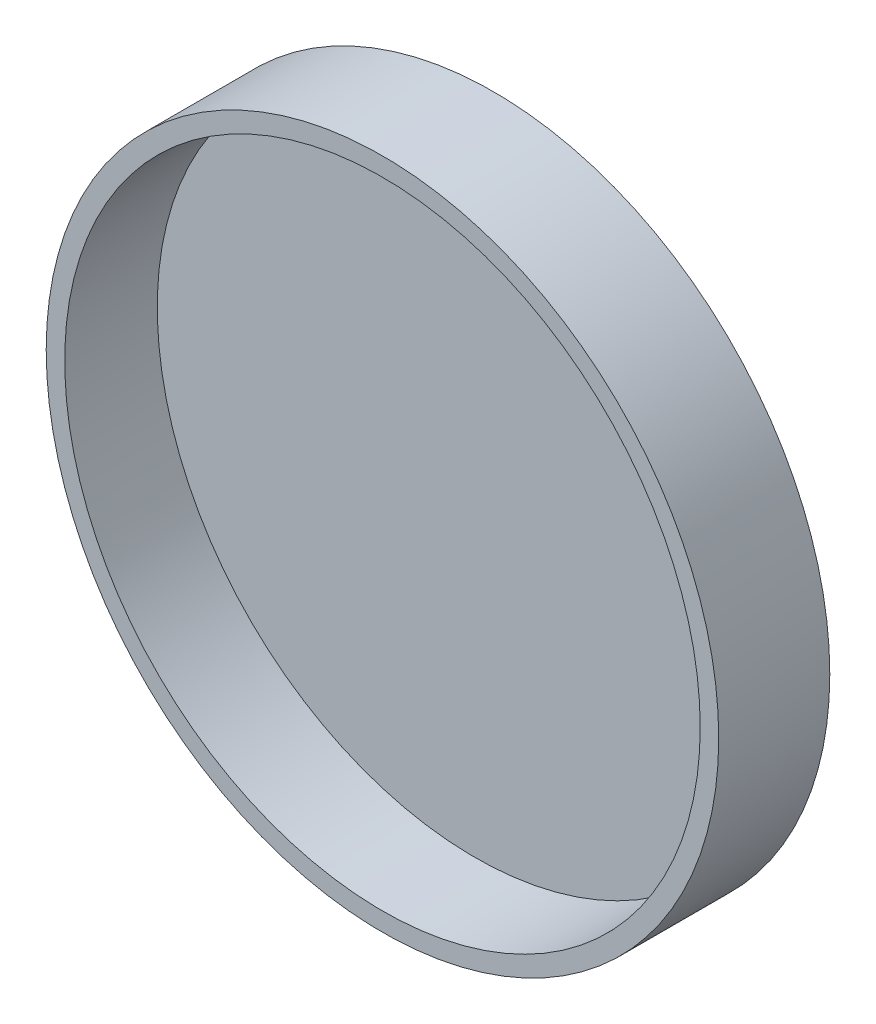
ISO-10303-21;
HEADER;
FILE_DESCRIPTION(('STEP AP214'),'2;1');
FILE_NAME('part.step','',(''),(''),'','','');
FILE_SCHEMA(('AUTOMOTIVE_DESIGN { 1 0 10303 214 1 1 1 1 }'));
ENDSEC;
DATA;
#1=APPLICATION_CONTEXT('core data for automotive mechanical design processes');
#2=APPLICATION_PROTOCOL_DEFINITION('international standard','automotive_design',2000,#1);
#3=PRODUCT_CONTEXT('',#1,'mechanical');
#4=PRODUCT('Part','Part','',(#3));
#5=PRODUCT_RELATED_PRODUCT_CATEGORY('part','',(#4));
#6=PRODUCT_DEFINITION_FORMATION('','',#4);
#7=PRODUCT_DEFINITION_CONTEXT('part definition',#1,'design');
#8=PRODUCT_DEFINITION('design','',#6,#7);
#9=PRODUCT_DEFINITION_SHAPE('','',#8);
#10=(LENGTH_UNIT() NAMED_UNIT(*) SI_UNIT(.MILLI.,.METRE.));
#11=(NAMED_UNIT(*) PLANE_ANGLE_UNIT() SI_UNIT($,.RADIAN.));
#12=(NAMED_UNIT(*) SI_UNIT($,.STERADIAN.) SOLID_ANGLE_UNIT());
#13=UNCERTAINTY_MEASURE_WITH_UNIT(LENGTH_MEASURE(1.E-05),#10,'distance_accuracy_value','');
#14=(GEOMETRIC_REPRESENTATION_CONTEXT(3) GLOBAL_UNCERTAINTY_ASSIGNED_CONTEXT((#13)) GLOBAL_UNIT_ASSIGNED_CONTEXT((#10,
#11,#12)) REPRESENTATION_CONTEXT('',''));
#15=CARTESIAN_POINT('',(0.,0.,0.));
#16=DIRECTION('',(0.,0.,1.));
#17=DIRECTION('',(1.,0.,0.));
#18=AXIS2_PLACEMENT_3D('',#15,#16,#17);
#19=CARTESIAN_POINT('',(0.,0.,15.));
#20=DIRECTION('',(0.,0.,1.));
#21=DIRECTION('',(1.,0.,0.));
#22=AXIS2_PLACEMENT_3D('',#19,#20,#21);
#23=PLANE('',#22);
#24=CARTESIAN_POINT('',(0.,0.,15.));
#25=DIRECTION('',(0.,0.,1.));
#26=DIRECTION('',(1.,0.,0.));
#27=AXIS2_PLACEMENT_3D('',#24,#25,#26);
#28=CIRCLE('',#27,54.5);
#29=CARTESIAN_POINT('',(54.5,0.,15.));
#30=VERTEX_POINT('',#29);
#31=EDGE_CURVE('E10',#30,#30,#28,.T.);
#32=ORIENTED_EDGE('',*,*,#31,.T.);
#33=EDGE_LOOP('',(#32));
#34=FACE_BOUND('',#33,.T.);
#35=CARTESIAN_POINT('',(0.,0.,15.));
#36=DIRECTION('',(0.,0.,1.));
#37=DIRECTION('',(1.,0.,0.));
#38=AXIS2_PLACEMENT_3D('',#35,#36,#37);
#39=CIRCLE('',#38,51.5);
#40=CARTESIAN_POINT('',(51.5,0.,15.));
#41=VERTEX_POINT('',#40);
#42=EDGE_CURVE('E38',#41,#41,#39,.T.);
#43=ORIENTED_EDGE('',*,*,#42,.F.);
#44=EDGE_LOOP('',(#43));
#45=FACE_BOUND('',#44,.T.);
#46=ADVANCED_FACE('F31',(#34,#45),#23,.T.);
#47=CARTESIAN_POINT('',(0.,0.,15.));
#48=DIRECTION('',(0.,0.,-1.));
#49=DIRECTION('',(-1.,0.,0.));
#50=AXIS2_PLACEMENT_3D('',#47,#48,#49);
#51=CYLINDRICAL_SURFACE('',#50,54.5);
#52=ORIENTED_EDGE('',*,*,#31,.F.);
#53=EDGE_LOOP('',(#52));
#54=FACE_BOUND('',#53,.T.);
#55=CARTESIAN_POINT('',(0.,0.,-3.));
#56=DIRECTION('',(0.,0.,-1.));
#57=DIRECTION('',(-1.,0.,0.));
#58=AXIS2_PLACEMENT_3D('',#55,#56,#57);
#59=CIRCLE('',#58,54.5);
#60=CARTESIAN_POINT('',(-54.5,0.,-3.));
#61=VERTEX_POINT('',#60);
#62=EDGE_CURVE('E47',#61,#61,#59,.T.);
#63=ORIENTED_EDGE('',*,*,#62,.F.);
#64=EDGE_LOOP('',(#63));
#65=FACE_BOUND('',#64,.T.);
#66=ADVANCED_FACE('F33',(#54,#65),#51,.T.);
#67=CARTESIAN_POINT('',(0.,0.,15.));
#68=DIRECTION('',(0.,0.,-1.));
#69=DIRECTION('',(-1.,0.,0.));
#70=AXIS2_PLACEMENT_3D('',#67,#68,#69);
#71=CYLINDRICAL_SURFACE('',#70,51.5);
#72=ORIENTED_EDGE('',*,*,#42,.T.);
#73=EDGE_LOOP('',(#72));
#74=FACE_BOUND('',#73,.T.);
#75=CARTESIAN_POINT('',(0.,0.,0.));
#76=DIRECTION('',(0.,0.,1.));
#77=DIRECTION('',(1.,0.,0.));
#78=AXIS2_PLACEMENT_3D('',#75,#76,#77);
#79=CIRCLE('',#78,51.5);
#80=CARTESIAN_POINT('',(51.5,0.,0.));
#81=VERTEX_POINT('',#80);
#82=EDGE_CURVE('E42',#81,#81,#79,.T.);
#83=ORIENTED_EDGE('',*,*,#82,.F.);
#84=EDGE_LOOP('',(#83));
#85=FACE_BOUND('',#84,.T.);
#86=ADVANCED_FACE('F55',(#74,#85),#71,.F.);
#87=CARTESIAN_POINT('',(0.,0.,0.));
#88=DIRECTION('',(0.,0.,-1.));
#89=DIRECTION('',(-1.,0.,0.));
#90=AXIS2_PLACEMENT_3D('',#87,#88,#89);
#91=PLANE('',#90);
#92=ORIENTED_EDGE('',*,*,#82,.T.);
#93=EDGE_LOOP('',(#92));
#94=FACE_BOUND('',#93,.T.);
#95=ADVANCED_FACE('F61',(#94),#91,.F.);
#96=CARTESIAN_POINT('',(0.,0.,-3.));
#97=DIRECTION('',(0.,0.,-1.));
#98=DIRECTION('',(-1.,0.,0.));
#99=AXIS2_PLACEMENT_3D('',#96,#97,#98);
#100=PLANE('',#99);
#101=ORIENTED_EDGE('',*,*,#62,.T.);
#102=EDGE_LOOP('',(#101));
#103=FACE_BOUND('',#102,.T.);
#104=ADVANCED_FACE('F52',(#103),#100,.T.);
#105=CLOSED_SHELL('',(#46,#66,#86,#95,#104));
#106=MANIFOLD_SOLID_BREP('B2',#105);
#107=ADVANCED_BREP_SHAPE_REPRESENTATION('',(#18,#106),#14);
#108=SHAPE_DEFINITION_REPRESENTATION(#9,#107);
ENDSEC;
END-ISO-10303-21;
